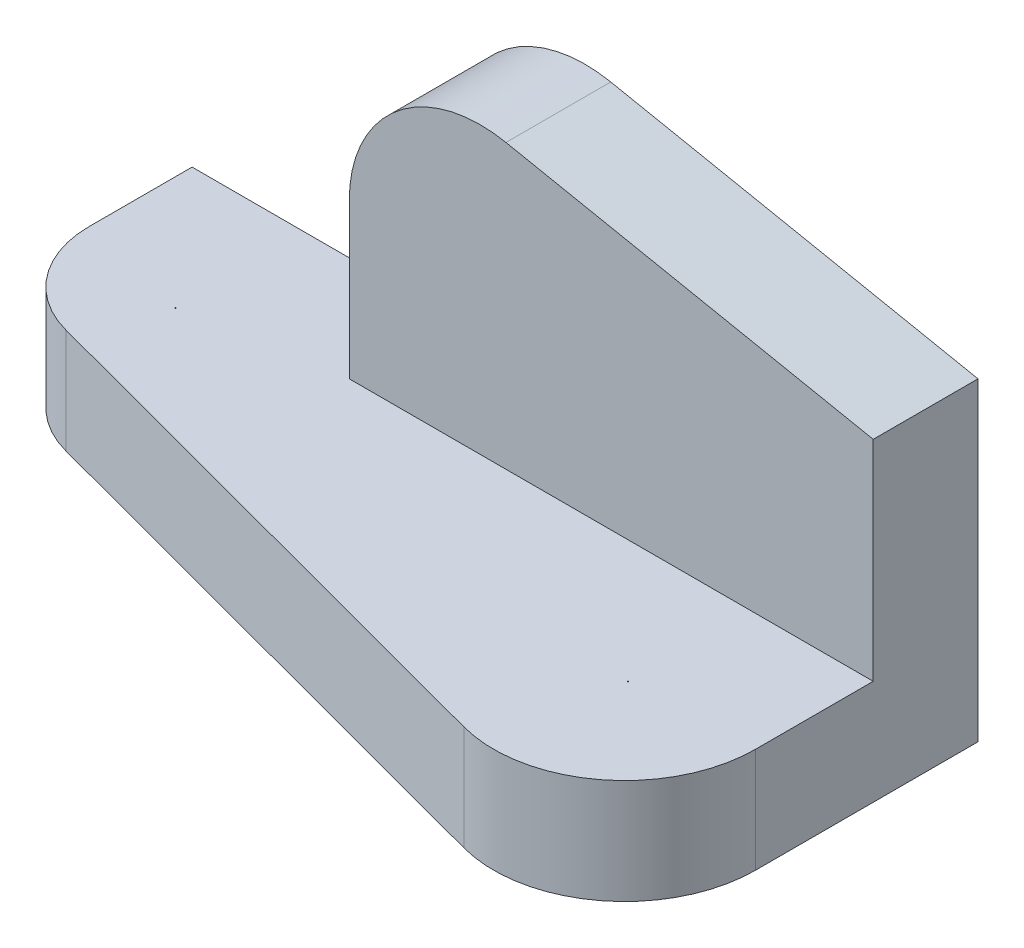
ISO-10303-21;
HEADER;
FILE_DESCRIPTION(('STEP AP214'),'2;1');
FILE_NAME('part.step','',(''),(''),'','','');
FILE_SCHEMA(('AUTOMOTIVE_DESIGN { 1 0 10303 214 1 1 1 1 }'));
ENDSEC;
DATA;
#1=APPLICATION_CONTEXT('core data for automotive mechanical design processes');
#2=APPLICATION_PROTOCOL_DEFINITION('international standard','automotive_design',2000,#1);
#3=PRODUCT_CONTEXT('',#1,'mechanical');
#4=PRODUCT('Part','Part','',(#3));
#5=PRODUCT_RELATED_PRODUCT_CATEGORY('part','',(#4));
#6=PRODUCT_DEFINITION_FORMATION('','',#4);
#7=PRODUCT_DEFINITION_CONTEXT('part definition',#1,'design');
#8=PRODUCT_DEFINITION('design','',#6,#7);
#9=PRODUCT_DEFINITION_SHAPE('','',#8);
#10=(LENGTH_UNIT() NAMED_UNIT(*) SI_UNIT(.MILLI.,.METRE.));
#11=(NAMED_UNIT(*) PLANE_ANGLE_UNIT() SI_UNIT($,.RADIAN.));
#12=(NAMED_UNIT(*) SI_UNIT($,.STERADIAN.) SOLID_ANGLE_UNIT());
#13=UNCERTAINTY_MEASURE_WITH_UNIT(LENGTH_MEASURE(1.E-05),#10,'distance_accuracy_value','');
#14=(GEOMETRIC_REPRESENTATION_CONTEXT(3) GLOBAL_UNCERTAINTY_ASSIGNED_CONTEXT((#13)) GLOBAL_UNIT_ASSIGNED_CONTEXT((#10,
#11,#12)) REPRESENTATION_CONTEXT('',''));
#15=CARTESIAN_POINT('',(0.,0.,0.));
#16=DIRECTION('',(0.,0.,1.));
#17=DIRECTION('',(1.,0.,0.));
#18=AXIS2_PLACEMENT_3D('',#15,#16,#17);
#19=CARTESIAN_POINT('',(0.,20.,0.));
#20=DIRECTION('',(0.,-1.,0.));
#21=DIRECTION('',(0.,0.,-1.));
#22=AXIS2_PLACEMENT_3D('',#19,#20,#21);
#23=PLANE('',#22);
#24=CARTESIAN_POINT('',(21.6996532647946,20.,-10.1408849836629));
#25=DIRECTION('',(0.,1.,0.));
#26=DIRECTION('',(0.,0.,1.));
#27=AXIS2_PLACEMENT_3D('',#24,#25,#26);
#28=CIRCLE('',#27,0.0999999999999994);
#29=CARTESIAN_POINT('',(21.6996532647946,20.,-10.0408849836629));
#30=VERTEX_POINT('',#29);
#31=EDGE_CURVE('E254',#30,#30,#28,.T.);
#32=ORIENTED_EDGE('',*,*,#31,.F.);
#33=EDGE_LOOP('',(#32));
#34=FACE_BOUND('',#33,.T.);
#35=DIRECTION('',(-0.966234939601246,0.,-0.257662650560332));
#36=VECTOR('',#35,1.);
#37=CARTESIAN_POINT('',(150.,20.,39.9999999999999));
#38=LINE('',#37,#36);
#39=CARTESIAN_POINT('',(118.558433735992,20.,31.6155823295977));
#40=VERTEX_POINT('',#39);
#41=CARTESIAN_POINT('',(14.8467469887934,20.,3.9591325303449));
#42=VERTEX_POINT('',#41);
#43=EDGE_CURVE('E174',#40,#42,#38,.T.);
#44=ORIENTED_EDGE('',*,*,#43,.F.);
#45=CARTESIAN_POINT('',(125.,20.,7.45970883956658));
#46=DIRECTION('',(0.,-1.,0.));
#47=DIRECTION('',(0.,0.,-1.));
#48=AXIS2_PLACEMENT_3D('',#45,#46,#47);
#49=CIRCLE('',#48,25.);
#50=CARTESIAN_POINT('',(150.,20.,7.45970883956658));
#51=VERTEX_POINT('',#50);
#52=EDGE_CURVE('E218',#40,#51,#49,.F.);
#53=ORIENTED_EDGE('',*,*,#52,.T.);
#54=DIRECTION('',(0.,0.,1.));
#55=VECTOR('',#54,1.);
#56=CARTESIAN_POINT('',(150.,20.,-35.));
#57=LINE('',#56,#55);
#58=CARTESIAN_POINT('',(150.,20.,-15.0000000000001));
#59=VERTEX_POINT('',#58);
#60=EDGE_CURVE('E171',#59,#51,#57,.T.);
#61=ORIENTED_EDGE('',*,*,#60,.F.);
#62=DIRECTION('',(-1.,0.,0.));
#63=VECTOR('',#62,1.);
#64=CARTESIAN_POINT('',(0.,20.,-15.));
#65=LINE('',#64,#63);
#66=CARTESIAN_POINT('',(50.,20.,-15.));
#67=VERTEX_POINT('',#66);
#68=EDGE_CURVE('E140',#59,#67,#65,.T.);
#69=ORIENTED_EDGE('',*,*,#68,.T.);
#70=DIRECTION('',(0.,0.,-1.));
#71=VECTOR('',#70,1.);
#72=CARTESIAN_POINT('',(50.,20.,0.));
#73=LINE('',#72,#71);
#74=CARTESIAN_POINT('',(50.,20.,-35.));
#75=VERTEX_POINT('',#74);
#76=EDGE_CURVE('E158',#67,#75,#73,.T.);
#77=ORIENTED_EDGE('',*,*,#76,.T.);
#78=DIRECTION('',(1.,0.,0.));
#79=VECTOR('',#78,1.);
#80=CARTESIAN_POINT('',(0.,20.,-35.));
#81=LINE('',#80,#79);
#82=CARTESIAN_POINT('',(0.,20.,-35.));
#83=VERTEX_POINT('',#82);
#84=EDGE_CURVE('E166',#83,#75,#81,.T.);
#85=ORIENTED_EDGE('',*,*,#84,.F.);
#86=DIRECTION('',(0.,0.,-1.));
#87=VECTOR('',#86,1.);
#88=CARTESIAN_POINT('',(0.,20.,0.));
#89=LINE('',#88,#87);
#90=CARTESIAN_POINT('',(0.,20.,-15.36556626168));
#91=VERTEX_POINT('',#90);
#92=EDGE_CURVE('E163',#91,#83,#89,.T.);
#93=ORIENTED_EDGE('',*,*,#92,.F.);
#94=CARTESIAN_POINT('',(20.,20.,-15.36556626168));
#95=DIRECTION('',(0.,-1.,0.));
#96=DIRECTION('',(0.,0.,-1.));
#97=AXIS2_PLACEMENT_3D('',#94,#95,#96);
#98=CIRCLE('',#97,20.);
#99=EDGE_CURVE('E204',#91,#42,#98,.F.);
#100=ORIENTED_EDGE('',*,*,#99,.T.);
#101=EDGE_LOOP('',(#44,#53,#61,#69,#77,#85,#93,#100));
#102=FACE_BOUND('',#101,.T.);
#103=CARTESIAN_POINT('',(126.617539362369,20.,8.44456912505025));
#104=DIRECTION('',(0.,1.,0.));
#105=DIRECTION('',(0.,0.,1.));
#106=AXIS2_PLACEMENT_3D('',#103,#104,#105);
#107=CIRCLE('',#106,0.099999999999989);
#108=CARTESIAN_POINT('',(126.617539362369,20.,8.54456912505024));
#109=VERTEX_POINT('',#108);
#110=EDGE_CURVE('E246',#109,#109,#107,.T.);
#111=ORIENTED_EDGE('',*,*,#110,.F.);
#112=EDGE_LOOP('',(#111));
#113=FACE_BOUND('',#112,.T.);
#114=ADVANCED_FACE('F45',(#34,#102,#113),#23,.F.);
#115=CARTESIAN_POINT('',(0.,20.,0.));
#116=DIRECTION('',(-1.,0.,0.));
#117=DIRECTION('',(0.,0.,1.));
#118=AXIS2_PLACEMENT_3D('',#115,#116,#117);
#119=PLANE('',#118);
#120=DIRECTION('',(0.,0.,-1.));
#121=VECTOR('',#120,1.);
#122=CARTESIAN_POINT('',(0.,0.,0.));
#123=LINE('',#122,#121);
#124=CARTESIAN_POINT('',(0.,0.,-15.36556626168));
#125=VERTEX_POINT('',#124);
#126=CARTESIAN_POINT('',(0.,0.,-35.));
#127=VERTEX_POINT('',#126);
#128=EDGE_CURVE('E162',#125,#127,#123,.T.);
#129=ORIENTED_EDGE('',*,*,#128,.F.);
#130=DIRECTION('',(0.,-1.,0.));
#131=VECTOR('',#130,1.);
#132=CARTESIAN_POINT('',(0.,20.,-15.36556626168));
#133=LINE('',#132,#131);
#134=EDGE_CURVE('E201',#125,#91,#133,.F.);
#135=ORIENTED_EDGE('',*,*,#134,.T.);
#136=ORIENTED_EDGE('',*,*,#92,.T.);
#137=DIRECTION('',(0.,-1.,0.));
#138=VECTOR('',#137,1.);
#139=CARTESIAN_POINT('',(0.,20.,-35.));
#140=LINE('',#139,#138);
#141=EDGE_CURVE('E177',#83,#127,#140,.T.);
#142=ORIENTED_EDGE('',*,*,#141,.T.);
#143=EDGE_LOOP('',(#129,#135,#136,#142));
#144=FACE_BOUND('',#143,.T.);
#145=ADVANCED_FACE('F262',(#144),#119,.T.);
#146=CARTESIAN_POINT('',(150.,20.,39.9999999999999));
#147=DIRECTION('',(-0.257662650560332,0.,0.966234939601246));
#148=DIRECTION('',(0.966234939601246,0.,0.257662650560332));
#149=AXIS2_PLACEMENT_3D('',#146,#147,#148);
#150=PLANE('',#149);
#151=DIRECTION('',(-0.966234939601246,0.,-0.257662650560332));
#152=VECTOR('',#151,1.);
#153=CARTESIAN_POINT('',(150.,0.,39.9999999999999));
#154=LINE('',#153,#152);
#155=CARTESIAN_POINT('',(118.558433735992,0.,31.6155823295977));
#156=VERTEX_POINT('',#155);
#157=CARTESIAN_POINT('',(14.8467469887934,0.,3.9591325303449));
#158=VERTEX_POINT('',#157);
#159=EDGE_CURVE('E167',#156,#158,#154,.T.);
#160=ORIENTED_EDGE('',*,*,#159,.F.);
#161=DIRECTION('',(0.,-1.,0.));
#162=VECTOR('',#161,1.);
#163=CARTESIAN_POINT('',(118.558433735992,20.,31.6155823295977));
#164=LINE('',#163,#162);
#165=EDGE_CURVE('E215',#156,#40,#164,.F.);
#166=ORIENTED_EDGE('',*,*,#165,.T.);
#167=ORIENTED_EDGE('',*,*,#43,.T.);
#168=DIRECTION('',(0.,-1.,0.));
#169=VECTOR('',#168,1.);
#170=CARTESIAN_POINT('',(14.8467469887933,20.,3.95913253034488));
#171=LINE('',#170,#169);
#172=EDGE_CURVE('E191',#42,#158,#171,.T.);
#173=ORIENTED_EDGE('',*,*,#172,.T.);
#174=EDGE_LOOP('',(#160,#166,#167,#173));
#175=FACE_BOUND('',#174,.T.);
#176=ADVANCED_FACE('F269',(#175),#150,.T.);
#177=CARTESIAN_POINT('',(150.,20.,-35.));
#178=DIRECTION('',(1.,0.,0.));
#179=DIRECTION('',(0.,0.,-1.));
#180=AXIS2_PLACEMENT_3D('',#177,#178,#179);
#181=PLANE('',#180);
#182=ORIENTED_EDGE('',*,*,#60,.T.);
#183=DIRECTION('',(0.,-1.,0.));
#184=VECTOR('',#183,1.);
#185=CARTESIAN_POINT('',(150.,20.,7.45970883956658));
#186=LINE('',#185,#184);
#187=CARTESIAN_POINT('',(150.,0.,7.45970883956658));
#188=VERTEX_POINT('',#187);
#189=EDGE_CURVE('E208',#51,#188,#186,.T.);
#190=ORIENTED_EDGE('',*,*,#189,.T.);
#191=DIRECTION('',(0.,0.,1.));
#192=VECTOR('',#191,1.);
#193=CARTESIAN_POINT('',(150.,0.,-35.));
#194=LINE('',#193,#192);
#195=CARTESIAN_POINT('',(150.,0.,-35.));
#196=VERTEX_POINT('',#195);
#197=EDGE_CURVE('E183',#196,#188,#194,.T.);
#198=ORIENTED_EDGE('',*,*,#197,.F.);
#199=DIRECTION('',(0.,-1.,0.));
#200=VECTOR('',#199,1.);
#201=CARTESIAN_POINT('',(150.,20.,-35.));
#202=LINE('',#201,#200);
#203=CARTESIAN_POINT('',(150.,60.,-35.));
#204=VERTEX_POINT('',#203);
#205=EDGE_CURVE('E138',#204,#196,#202,.T.);
#206=ORIENTED_EDGE('',*,*,#205,.F.);
#207=DIRECTION('',(0.,0.,-1.));
#208=VECTOR('',#207,1.);
#209=CARTESIAN_POINT('',(150.,60.,-15.0000000000001));
#210=LINE('',#209,#208);
#211=CARTESIAN_POINT('',(150.,60.,-15.0000000000001));
#212=VERTEX_POINT('',#211);
#213=EDGE_CURVE('E122',#212,#204,#210,.T.);
#214=ORIENTED_EDGE('',*,*,#213,.F.);
#215=DIRECTION('',(0.,-1.,0.));
#216=VECTOR('',#215,1.);
#217=CARTESIAN_POINT('',(150.,0.,-15.0000000000001));
#218=LINE('',#217,#216);
#219=EDGE_CURVE('E127',#212,#59,#218,.T.);
#220=ORIENTED_EDGE('',*,*,#219,.T.);
#221=EDGE_LOOP('',(#182,#190,#198,#206,#214,#220));
#222=FACE_BOUND('',#221,.T.);
#223=ADVANCED_FACE('F134',(#222),#181,.T.);
#224=CARTESIAN_POINT('',(0.,20.,-35.));
#225=DIRECTION('',(0.,0.,-1.));
#226=DIRECTION('',(-1.,0.,0.));
#227=AXIS2_PLACEMENT_3D('',#224,#225,#226);
#228=PLANE('',#227);
#229=DIRECTION('',(0.,1.,0.));
#230=VECTOR('',#229,1.);
#231=CARTESIAN_POINT('',(50.,80.,-35.));
#232=LINE('',#231,#230);
#233=CARTESIAN_POINT('',(50.,49.5049024320361,-35.));
#234=VERTEX_POINT('',#233);
#235=EDGE_CURVE('E149',#75,#234,#232,.T.);
#236=ORIENTED_EDGE('',*,*,#235,.T.);
#237=CARTESIAN_POINT('',(75.,49.5049024320361,-35.));
#238=DIRECTION('',(0.,0.,-1.));
#239=DIRECTION('',(-1.,0.,0.));
#240=AXIS2_PLACEMENT_3D('',#237,#238,#239);
#241=CIRCLE('',#240,25.);
#242=CARTESIAN_POINT('',(79.9029033784546,74.0194193243091,-35.));
#243=VERTEX_POINT('',#242);
#244=EDGE_CURVE('E68',#234,#243,#241,.T.);
#245=ORIENTED_EDGE('',*,*,#244,.T.);
#246=DIRECTION('',(0.98058067569092,-0.196116135138184,0.));
#247=VECTOR('',#246,1.);
#248=CARTESIAN_POINT('',(150.,60.,-35.));
#249=LINE('',#248,#247);
#250=EDGE_CURVE('E152',#243,#204,#249,.T.);
#251=ORIENTED_EDGE('',*,*,#250,.T.);
#252=ORIENTED_EDGE('',*,*,#205,.T.);
#253=DIRECTION('',(1.,0.,0.));
#254=VECTOR('',#253,1.);
#255=CARTESIAN_POINT('',(0.,0.,-35.));
#256=LINE('',#255,#254);
#257=EDGE_CURVE('E180',#127,#196,#256,.T.);
#258=ORIENTED_EDGE('',*,*,#257,.F.);
#259=ORIENTED_EDGE('',*,*,#141,.F.);
#260=ORIENTED_EDGE('',*,*,#84,.T.);
#261=EDGE_LOOP('',(#236,#245,#251,#252,#258,#259,#260));
#262=FACE_BOUND('',#261,.T.);
#263=ADVANCED_FACE('F232',(#262),#228,.T.);
#264=CARTESIAN_POINT('',(0.,0.,0.));
#265=DIRECTION('',(0.,-1.,0.));
#266=DIRECTION('',(0.,0.,-1.));
#267=AXIS2_PLACEMENT_3D('',#264,#265,#266);
#268=PLANE('',#267);
#269=CARTESIAN_POINT('',(21.6996532647946,0.,-10.1408849836629));
#270=DIRECTION('',(0.,1.,0.));
#271=DIRECTION('',(0.,0.,1.));
#272=AXIS2_PLACEMENT_3D('',#269,#270,#271);
#273=CIRCLE('',#272,0.0999999999999959);
#274=CARTESIAN_POINT('',(21.6996532647946,0.,-10.0408849836629));
#275=VERTEX_POINT('',#274);
#276=EDGE_CURVE('E250',#275,#275,#273,.T.);
#277=ORIENTED_EDGE('',*,*,#276,.T.);
#278=EDGE_LOOP('',(#277));
#279=FACE_BOUND('',#278,.T.);
#280=CARTESIAN_POINT('',(126.617539362369,0.,8.44456912505025));
#281=DIRECTION('',(0.,1.,0.));
#282=DIRECTION('',(0.,0.,1.));
#283=AXIS2_PLACEMENT_3D('',#280,#281,#282);
#284=CIRCLE('',#283,0.099999999999989);
#285=CARTESIAN_POINT('',(126.617539362369,0.,8.54456912505024));
#286=VERTEX_POINT('',#285);
#287=EDGE_CURVE('E153',#286,#286,#284,.T.);
#288=ORIENTED_EDGE('',*,*,#287,.T.);
#289=EDGE_LOOP('',(#288));
#290=FACE_BOUND('',#289,.T.);
#291=ORIENTED_EDGE('',*,*,#197,.T.);
#292=CARTESIAN_POINT('',(125.,0.,7.45970883956658));
#293=DIRECTION('',(0.,-1.,0.));
#294=DIRECTION('',(0.,0.,-1.));
#295=AXIS2_PLACEMENT_3D('',#292,#293,#294);
#296=CIRCLE('',#295,25.);
#297=EDGE_CURVE('E212',#188,#156,#296,.T.);
#298=ORIENTED_EDGE('',*,*,#297,.T.);
#299=ORIENTED_EDGE('',*,*,#159,.T.);
#300=CARTESIAN_POINT('',(20.,0.,-15.36556626168));
#301=DIRECTION('',(0.,-1.,0.));
#302=DIRECTION('',(0.,0.,-1.));
#303=AXIS2_PLACEMENT_3D('',#300,#301,#302);
#304=CIRCLE('',#303,20.);
#305=EDGE_CURVE('E198',#158,#125,#304,.T.);
#306=ORIENTED_EDGE('',*,*,#305,.T.);
#307=ORIENTED_EDGE('',*,*,#128,.T.);
#308=ORIENTED_EDGE('',*,*,#257,.T.);
#309=EDGE_LOOP('',(#291,#298,#299,#306,#307,#308));
#310=FACE_BOUND('',#309,.T.);
#311=ADVANCED_FACE('F275',(#279,#290,#310),#268,.T.);
#312=CARTESIAN_POINT('',(50.,80.,-15.));
#313=DIRECTION('',(-1.,0.,0.));
#314=DIRECTION('',(0.,0.,1.));
#315=AXIS2_PLACEMENT_3D('',#312,#313,#314);
#316=PLANE('',#315);
#317=DIRECTION('',(0.,1.,0.));
#318=VECTOR('',#317,1.);
#319=CARTESIAN_POINT('',(50.,80.,-15.));
#320=LINE('',#319,#318);
#321=CARTESIAN_POINT('',(50.,49.5049024320361,-15.));
#322=VERTEX_POINT('',#321);
#323=EDGE_CURVE('E128',#67,#322,#320,.T.);
#324=ORIENTED_EDGE('',*,*,#323,.T.);
#325=DIRECTION('',(0.,0.,-1.));
#326=VECTOR('',#325,1.);
#327=CARTESIAN_POINT('',(50.,49.5049024320361,-15.));
#328=LINE('',#327,#326);
#329=EDGE_CURVE('E221',#322,#234,#328,.T.);
#330=ORIENTED_EDGE('',*,*,#329,.T.);
#331=ORIENTED_EDGE('',*,*,#235,.F.);
#332=ORIENTED_EDGE('',*,*,#76,.F.);
#333=EDGE_LOOP('',(#324,#330,#331,#332));
#334=FACE_BOUND('',#333,.T.);
#335=ADVANCED_FACE('F230',(#334),#316,.T.);
#336=CARTESIAN_POINT('',(0.,0.,-15.));
#337=DIRECTION('',(0.,0.,1.));
#338=DIRECTION('',(1.,0.,0.));
#339=AXIS2_PLACEMENT_3D('',#336,#337,#338);
#340=PLANE('',#339);
#341=DIRECTION('',(0.98058067569092,-0.196116135138184,0.));
#342=VECTOR('',#341,1.);
#343=CARTESIAN_POINT('',(150.,60.,-15.0000000000001));
#344=LINE('',#343,#342);
#345=CARTESIAN_POINT('',(79.9029033784546,74.0194193243091,-15.));
#346=VERTEX_POINT('',#345);
#347=EDGE_CURVE('E119',#346,#212,#344,.T.);
#348=ORIENTED_EDGE('',*,*,#347,.F.);
#349=CARTESIAN_POINT('',(75.,49.5049024320361,-15.));
#350=DIRECTION('',(0.,0.,1.));
#351=DIRECTION('',(1.,0.,0.));
#352=AXIS2_PLACEMENT_3D('',#349,#350,#351);
#353=CIRCLE('',#352,25.);
#354=EDGE_CURVE('E11',#346,#322,#353,.T.);
#355=ORIENTED_EDGE('',*,*,#354,.T.);
#356=ORIENTED_EDGE('',*,*,#323,.F.);
#357=ORIENTED_EDGE('',*,*,#68,.F.);
#358=ORIENTED_EDGE('',*,*,#219,.F.);
#359=EDGE_LOOP('',(#348,#355,#356,#357,#358));
#360=FACE_BOUND('',#359,.T.);
#361=ADVANCED_FACE('F142',(#360),#340,.T.);
#362=CARTESIAN_POINT('',(150.,60.,-15.0000000000001));
#363=DIRECTION('',(0.196116135138184,0.98058067569092,0.));
#364=DIRECTION('',(-0.98058067569092,0.196116135138184,0.));
#365=AXIS2_PLACEMENT_3D('',#362,#363,#364);
#366=PLANE('',#365);
#367=ORIENTED_EDGE('',*,*,#250,.F.);
#368=DIRECTION('',(0.,0.,-1.));
#369=VECTOR('',#368,1.);
#370=CARTESIAN_POINT('',(79.9029033784546,74.0194193243091,-15.));
#371=LINE('',#370,#369);
#372=EDGE_CURVE('E54',#243,#346,#371,.F.);
#373=ORIENTED_EDGE('',*,*,#372,.T.);
#374=ORIENTED_EDGE('',*,*,#347,.T.);
#375=ORIENTED_EDGE('',*,*,#213,.T.);
#376=EDGE_LOOP('',(#367,#373,#374,#375));
#377=FACE_BOUND('',#376,.T.);
#378=ADVANCED_FACE('F121',(#377),#366,.T.);
#379=CARTESIAN_POINT('',(20.,20.,-15.36556626168));
#380=DIRECTION('',(0.,-1.,0.));
#381=DIRECTION('',(0.,0.,-1.));
#382=AXIS2_PLACEMENT_3D('',#379,#380,#381);
#383=CYLINDRICAL_SURFACE('',#382,20.);
#384=ORIENTED_EDGE('',*,*,#99,.F.);
#385=ORIENTED_EDGE('',*,*,#134,.F.);
#386=ORIENTED_EDGE('',*,*,#305,.F.);
#387=ORIENTED_EDGE('',*,*,#172,.F.);
#388=EDGE_LOOP('',(#384,#385,#386,#387));
#389=FACE_BOUND('',#388,.T.);
#390=ADVANCED_FACE('F285',(#389),#383,.T.);
#391=CARTESIAN_POINT('',(125.,20.,7.45970883956658));
#392=DIRECTION('',(0.,-1.,0.));
#393=DIRECTION('',(0.,0.,-1.));
#394=AXIS2_PLACEMENT_3D('',#391,#392,#393);
#395=CYLINDRICAL_SURFACE('',#394,25.);
#396=ORIENTED_EDGE('',*,*,#52,.F.);
#397=ORIENTED_EDGE('',*,*,#165,.F.);
#398=ORIENTED_EDGE('',*,*,#297,.F.);
#399=ORIENTED_EDGE('',*,*,#189,.F.);
#400=EDGE_LOOP('',(#396,#397,#398,#399));
#401=FACE_BOUND('',#400,.T.);
#402=ADVANCED_FACE('F287',(#401),#395,.T.);
#403=CARTESIAN_POINT('',(75.,49.5049024320361,-15.));
#404=DIRECTION('',(0.,0.,-1.));
#405=DIRECTION('',(-1.,0.,0.));
#406=AXIS2_PLACEMENT_3D('',#403,#404,#405);
#407=CYLINDRICAL_SURFACE('',#406,25.);
#408=ORIENTED_EDGE('',*,*,#354,.F.);
#409=ORIENTED_EDGE('',*,*,#372,.F.);
#410=ORIENTED_EDGE('',*,*,#244,.F.);
#411=ORIENTED_EDGE('',*,*,#329,.F.);
#412=EDGE_LOOP('',(#408,#409,#410,#411));
#413=FACE_BOUND('',#412,.T.);
#414=ADVANCED_FACE('F47',(#413),#407,.T.);
#415=CARTESIAN_POINT('',(126.617539362369,20.,8.44456912505025));
#416=DIRECTION('',(0.,1.,0.));
#417=DIRECTION('',(0.,0.,1.));
#418=AXIS2_PLACEMENT_3D('',#415,#416,#417);
#419=CYLINDRICAL_SURFACE('',#418,0.099999999999989);
#420=ORIENTED_EDGE('',*,*,#287,.F.);
#421=EDGE_LOOP('',(#420));
#422=FACE_BOUND('',#421,.T.);
#423=ORIENTED_EDGE('',*,*,#110,.T.);
#424=EDGE_LOOP('',(#423));
#425=FACE_BOUND('',#424,.T.);
#426=ADVANCED_FACE('F294',(#422,#425),#419,.F.);
#427=CARTESIAN_POINT('',(21.6996532647946,20.,-10.1408849836629));
#428=DIRECTION('',(0.,1.,0.));
#429=DIRECTION('',(0.,0.,1.));
#430=AXIS2_PLACEMENT_3D('',#427,#428,#429);
#431=CYLINDRICAL_SURFACE('',#430,0.0999999999999977);
#432=ORIENTED_EDGE('',*,*,#276,.F.);
#433=EDGE_LOOP('',(#432));
#434=FACE_BOUND('',#433,.T.);
#435=ORIENTED_EDGE('',*,*,#31,.T.);
#436=EDGE_LOOP('',(#435));
#437=FACE_BOUND('',#436,.T.);
#438=ADVANCED_FACE('F259',(#434,#437),#431,.F.);
#439=CLOSED_SHELL('',(#114,#145,#176,#223,#263,#311,#335,#361,#378,#390,#402,#414,#426,#438));
#440=MANIFOLD_SOLID_BREP('B2',#439);
#441=ADVANCED_BREP_SHAPE_REPRESENTATION('',(#18,#440),#14);
#442=SHAPE_DEFINITION_REPRESENTATION(#9,#441);
ENDSEC;
END-ISO-10303-21;
